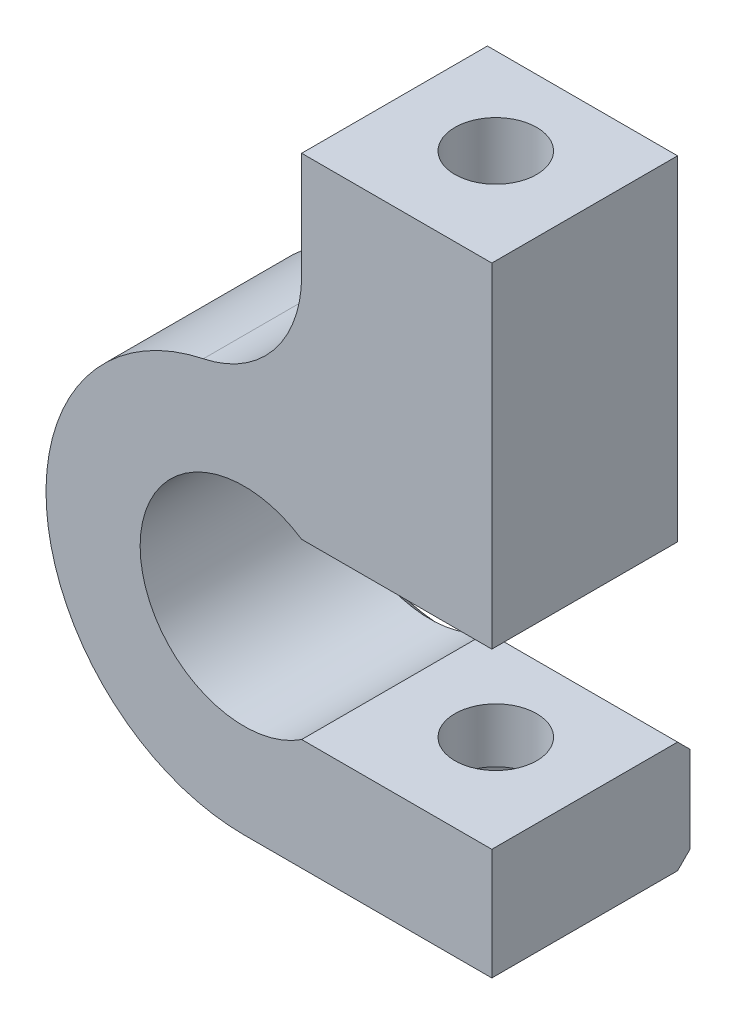
ISO-10303-21;
HEADER;
FILE_DESCRIPTION(('STEP AP214'),'2;1');
FILE_NAME('part.step','',(''),(''),'','','');
FILE_SCHEMA(('AUTOMOTIVE_DESIGN { 1 0 10303 214 1 1 1 1 }'));
ENDSEC;
DATA;
#1=APPLICATION_CONTEXT('core data for automotive mechanical design processes');
#2=APPLICATION_PROTOCOL_DEFINITION('international standard','automotive_design',2000,#1);
#3=PRODUCT_CONTEXT('',#1,'mechanical');
#4=PRODUCT('Part','Part','',(#3));
#5=PRODUCT_RELATED_PRODUCT_CATEGORY('part','',(#4));
#6=PRODUCT_DEFINITION_FORMATION('','',#4);
#7=PRODUCT_DEFINITION_CONTEXT('part definition',#1,'design');
#8=PRODUCT_DEFINITION('design','',#6,#7);
#9=PRODUCT_DEFINITION_SHAPE('','',#8);
#10=(LENGTH_UNIT() NAMED_UNIT(*) SI_UNIT(.MILLI.,.METRE.));
#11=(NAMED_UNIT(*) PLANE_ANGLE_UNIT() SI_UNIT($,.RADIAN.));
#12=(NAMED_UNIT(*) SI_UNIT($,.STERADIAN.) SOLID_ANGLE_UNIT());
#13=UNCERTAINTY_MEASURE_WITH_UNIT(LENGTH_MEASURE(1.E-05),#10,'distance_accuracy_value','');
#14=(GEOMETRIC_REPRESENTATION_CONTEXT(3) GLOBAL_UNCERTAINTY_ASSIGNED_CONTEXT((#13)) GLOBAL_UNIT_ASSIGNED_CONTEXT((#10,
#11,#12)) REPRESENTATION_CONTEXT('',''));
#15=CARTESIAN_POINT('',(0.,0.,0.));
#16=DIRECTION('',(0.,0.,1.));
#17=DIRECTION('',(1.,0.,0.));
#18=AXIS2_PLACEMENT_3D('',#15,#16,#17);
#19=CARTESIAN_POINT('',(6.16,8.,4.));
#20=DIRECTION('',(0.,-1.,0.));
#21=DIRECTION('',(0.,0.,-1.));
#22=AXIS2_PLACEMENT_3D('',#19,#20,#21);
#23=CYLINDRICAL_SURFACE('',#22,1.65);
#24=CARTESIAN_POINT('',(6.16,-3.5,4.));
#25=DIRECTION('',(0.,-1.,0.));
#26=DIRECTION('',(1.,0.,0.));
#27=AXIS2_PLACEMENT_3D('',#24,#25,#26);
#28=CIRCLE('',#27,1.65);
#29=CARTESIAN_POINT('',(7.81,-3.5,4.));
#30=VERTEX_POINT('',#29);
#31=EDGE_CURVE('E276',#30,#30,#28,.T.);
#32=ORIENTED_EDGE('',*,*,#31,.F.);
#33=EDGE_LOOP('',(#32));
#34=FACE_BOUND('',#33,.T.);
#35=CARTESIAN_POINT('',(6.16,-5.7,4.));
#36=DIRECTION('',(0.,-1.,0.));
#37=DIRECTION('',(0.,0.,-1.));
#38=AXIS2_PLACEMENT_3D('',#35,#36,#37);
#39=CIRCLE('',#38,1.65);
#40=CARTESIAN_POINT('',(6.16,-5.7,2.35));
#41=VERTEX_POINT('',#40);
#42=EDGE_CURVE('E261',#41,#41,#39,.F.);
#43=ORIENTED_EDGE('',*,*,#42,.F.);
#44=EDGE_LOOP('',(#43));
#45=FACE_BOUND('',#44,.T.);
#46=ADVANCED_FACE('F40',(#34,#45),#23,.F.);
#47=CARTESIAN_POINT('',(0.,0.,8.));
#48=DIRECTION('',(0.,0.,-1.));
#49=DIRECTION('',(-1.,0.,0.));
#50=AXIS2_PLACEMENT_3D('',#47,#48,#49);
#51=CYLINDRICAL_SURFACE('',#50,4.2);
#52=DIRECTION('',(0.,0.,-1.));
#53=VECTOR('',#52,1.);
#54=CARTESIAN_POINT('',(2.32163735324878,-3.5,8.));
#55=LINE('',#54,#53);
#56=CARTESIAN_POINT('',(2.32163735324878,-3.5,8.));
#57=VERTEX_POINT('',#56);
#58=CARTESIAN_POINT('',(2.32163735324878,-3.5,0.500000000000007));
#59=VERTEX_POINT('',#58);
#60=EDGE_CURVE('E287',#57,#59,#55,.T.);
#61=ORIENTED_EDGE('',*,*,#60,.T.);
#62=CARTESIAN_POINT('',(0.,0.,0.500000000000007));
#63=DIRECTION('',(0.,0.,1.));
#64=DIRECTION('',(1.,0.,0.));
#65=AXIS2_PLACEMENT_3D('',#62,#63,#64);
#66=CIRCLE('',#65,4.2);
#67=CARTESIAN_POINT('',(2.32163735324878,3.5,0.500000000000007));
#68=VERTEX_POINT('',#67);
#69=EDGE_CURVE('E11',#59,#68,#66,.F.);
#70=ORIENTED_EDGE('',*,*,#69,.T.);
#71=DIRECTION('',(0.,0.,-1.));
#72=VECTOR('',#71,1.);
#73=CARTESIAN_POINT('',(2.32163735324878,3.5,8.));
#74=LINE('',#73,#72);
#75=CARTESIAN_POINT('',(2.32163735324878,3.5,8.));
#76=VERTEX_POINT('',#75);
#77=EDGE_CURVE('E301',#76,#68,#74,.T.);
#78=ORIENTED_EDGE('',*,*,#77,.F.);
#79=CARTESIAN_POINT('',(0.,0.,8.));
#80=DIRECTION('',(0.,0.,-1.));
#81=DIRECTION('',(1.,0.,0.));
#82=AXIS2_PLACEMENT_3D('',#79,#80,#81);
#83=CIRCLE('',#82,4.2);
#84=EDGE_CURVE('E277',#57,#76,#83,.T.);
#85=ORIENTED_EDGE('',*,*,#84,.F.);
#86=EDGE_LOOP('',(#61,#70,#78,#85));
#87=FACE_BOUND('',#86,.T.);
#88=ADVANCED_FACE('F396',(#87),#51,.F.);
#89=CARTESIAN_POINT('',(10.,3.5,8.));
#90=DIRECTION('',(0.,1.,0.));
#91=DIRECTION('',(-1.,0.,0.));
#92=AXIS2_PLACEMENT_3D('',#89,#90,#91);
#93=PLANE('',#92);
#94=CARTESIAN_POINT('',(6.16,3.5,4.));
#95=DIRECTION('',(0.,1.,0.));
#96=DIRECTION('',(-1.,0.,0.));
#97=AXIS2_PLACEMENT_3D('',#94,#95,#96);
#98=CIRCLE('',#97,1.65);
#99=CARTESIAN_POINT('',(4.51,3.5,4.));
#100=VERTEX_POINT('',#99);
#101=EDGE_CURVE('E272',#100,#100,#98,.T.);
#102=ORIENTED_EDGE('',*,*,#101,.T.);
#103=EDGE_LOOP('',(#102));
#104=FACE_BOUND('',#103,.T.);
#105=ORIENTED_EDGE('',*,*,#77,.T.);
#106=DIRECTION('',(1.,0.,0.));
#107=VECTOR('',#106,1.);
#108=CARTESIAN_POINT('',(10.,3.5,0.500000000000007));
#109=LINE('',#108,#107);
#110=CARTESIAN_POINT('',(10.,3.5,0.500000000000007));
#111=VERTEX_POINT('',#110);
#112=EDGE_CURVE('E354',#68,#111,#109,.T.);
#113=ORIENTED_EDGE('',*,*,#112,.T.);
#114=DIRECTION('',(0.,0.,-1.));
#115=VECTOR('',#114,1.);
#116=CARTESIAN_POINT('',(10.,3.5,8.));
#117=LINE('',#116,#115);
#118=CARTESIAN_POINT('',(10.,3.5,8.));
#119=VERTEX_POINT('',#118);
#120=EDGE_CURVE('E299',#119,#111,#117,.T.);
#121=ORIENTED_EDGE('',*,*,#120,.F.);
#122=DIRECTION('',(1.,0.,0.));
#123=VECTOR('',#122,1.);
#124=CARTESIAN_POINT('',(10.,3.5,8.));
#125=LINE('',#124,#123);
#126=EDGE_CURVE('E211',#76,#119,#125,.T.);
#127=ORIENTED_EDGE('',*,*,#126,.F.);
#128=EDGE_LOOP('',(#105,#113,#121,#127));
#129=FACE_BOUND('',#128,.T.);
#130=ADVANCED_FACE('F404',(#104,#129),#93,.F.);
#131=CARTESIAN_POINT('',(10.,8.,8.));
#132=DIRECTION('',(-1.,0.,0.));
#133=DIRECTION('',(0.,0.,1.));
#134=AXIS2_PLACEMENT_3D('',#131,#132,#133);
#135=PLANE('',#134);
#136=ORIENTED_EDGE('',*,*,#120,.T.);
#137=DIRECTION('',(0.,1.,0.));
#138=VECTOR('',#137,1.);
#139=CARTESIAN_POINT('',(10.,8.,0.500000000000007));
#140=LINE('',#139,#138);
#141=CARTESIAN_POINT('',(10.,17.,0.500000000000007));
#142=VERTEX_POINT('',#141);
#143=EDGE_CURVE('E199',#111,#142,#140,.T.);
#144=ORIENTED_EDGE('',*,*,#143,.T.);
#145=DIRECTION('',(0.,0.,1.));
#146=VECTOR('',#145,1.);
#147=CARTESIAN_POINT('',(10.,17.,0.));
#148=LINE('',#147,#146);
#149=CARTESIAN_POINT('',(10.,17.,8.));
#150=VERTEX_POINT('',#149);
#151=EDGE_CURVE('E193',#142,#150,#148,.T.);
#152=ORIENTED_EDGE('',*,*,#151,.T.);
#153=DIRECTION('',(0.,1.,0.));
#154=VECTOR('',#153,1.);
#155=CARTESIAN_POINT('',(10.,8.,8.));
#156=LINE('',#155,#154);
#157=EDGE_CURVE('E197',#119,#150,#156,.T.);
#158=ORIENTED_EDGE('',*,*,#157,.F.);
#159=EDGE_LOOP('',(#136,#144,#152,#158));
#160=FACE_BOUND('',#159,.T.);
#161=ADVANCED_FACE('F196',(#160),#135,.F.);
#162=CARTESIAN_POINT('',(0.,0.,8.));
#163=DIRECTION('',(0.,0.,-1.));
#164=DIRECTION('',(-1.,0.,0.));
#165=AXIS2_PLACEMENT_3D('',#162,#163,#164);
#166=CYLINDRICAL_SURFACE('',#165,8.);
#167=DIRECTION('',(0.,0.,-1.));
#168=VECTOR('',#167,1.);
#169=CARTESIAN_POINT('',(-1.64822316723152,7.82836894831876,8.));
#170=LINE('',#169,#168);
#171=CARTESIAN_POINT('',(-1.64822316723152,7.82836894831876,8.));
#172=VERTEX_POINT('',#171);
#173=CARTESIAN_POINT('',(-1.64822316723152,7.82836894831876,0.500000000000007));
#174=VERTEX_POINT('',#173);
#175=EDGE_CURVE('E303',#172,#174,#170,.T.);
#176=ORIENTED_EDGE('',*,*,#175,.T.);
#177=CARTESIAN_POINT('',(0.,0.,0.500000000000007));
#178=DIRECTION('',(0.,0.,1.));
#179=DIRECTION('',(1.,0.,0.));
#180=AXIS2_PLACEMENT_3D('',#177,#178,#179);
#181=CIRCLE('',#180,8.);
#182=CARTESIAN_POINT('',(0.,-8.,0.500000000000007));
#183=VERTEX_POINT('',#182);
#184=EDGE_CURVE('E343',#174,#183,#181,.T.);
#185=ORIENTED_EDGE('',*,*,#184,.T.);
#186=DIRECTION('',(0.,0.,-1.));
#187=VECTOR('',#186,1.);
#188=CARTESIAN_POINT('',(0.,-8.,8.));
#189=LINE('',#188,#187);
#190=CARTESIAN_POINT('',(0.,-8.,8.));
#191=VERTEX_POINT('',#190);
#192=EDGE_CURVE('E296',#191,#183,#189,.T.);
#193=ORIENTED_EDGE('',*,*,#192,.F.);
#194=CARTESIAN_POINT('',(0.,0.,8.));
#195=DIRECTION('',(0.,0.,1.));
#196=DIRECTION('',(1.,0.,0.));
#197=AXIS2_PLACEMENT_3D('',#194,#195,#196);
#198=CIRCLE('',#197,8.);
#199=EDGE_CURVE('E213',#172,#191,#198,.T.);
#200=ORIENTED_EDGE('',*,*,#199,.F.);
#201=EDGE_LOOP('',(#176,#185,#193,#200));
#202=FACE_BOUND('',#201,.T.);
#203=ADVANCED_FACE('F492',(#202),#166,.T.);
#204=CARTESIAN_POINT('',(0.,-8.,8.));
#205=DIRECTION('',(0.,1.,0.));
#206=DIRECTION('',(0.,0.,1.));
#207=AXIS2_PLACEMENT_3D('',#204,#205,#206);
#208=PLANE('',#207);
#209=DIRECTION('',(-1.,0.,0.));
#210=VECTOR('',#209,1.);
#211=CARTESIAN_POINT('',(7.76,-8.,6.7712812921102));
#212=LINE('',#211,#210);
#213=CARTESIAN_POINT('',(7.76,-8.,6.7712812921102));
#214=VERTEX_POINT('',#213);
#215=CARTESIAN_POINT('',(4.56,-8.,6.7712812921102));
#216=VERTEX_POINT('',#215);
#217=EDGE_CURVE('E245',#214,#216,#212,.T.);
#218=ORIENTED_EDGE('',*,*,#217,.F.);
#219=DIRECTION('',(-0.5,0.,0.866025403784438));
#220=VECTOR('',#219,1.);
#221=CARTESIAN_POINT('',(9.36,-8.,4.));
#222=LINE('',#221,#220);
#223=CARTESIAN_POINT('',(9.36,-8.,4.));
#224=VERTEX_POINT('',#223);
#225=EDGE_CURVE('E220',#224,#214,#222,.T.);
#226=ORIENTED_EDGE('',*,*,#225,.F.);
#227=DIRECTION('',(0.5,0.,0.866025403784439));
#228=VECTOR('',#227,1.);
#229=CARTESIAN_POINT('',(7.76,-8.,1.2287187078898));
#230=LINE('',#229,#228);
#231=CARTESIAN_POINT('',(7.76,-8.,1.2287187078898));
#232=VERTEX_POINT('',#231);
#233=EDGE_CURVE('E228',#232,#224,#230,.T.);
#234=ORIENTED_EDGE('',*,*,#233,.F.);
#235=DIRECTION('',(1.,0.,0.));
#236=VECTOR('',#235,1.);
#237=CARTESIAN_POINT('',(4.56,-8.,1.2287187078898));
#238=LINE('',#237,#236);
#239=CARTESIAN_POINT('',(4.56,-8.,1.2287187078898));
#240=VERTEX_POINT('',#239);
#241=EDGE_CURVE('E254',#240,#232,#238,.T.);
#242=ORIENTED_EDGE('',*,*,#241,.F.);
#243=DIRECTION('',(0.5,0.,-0.866025403784439));
#244=VECTOR('',#243,1.);
#245=CARTESIAN_POINT('',(2.96,-8.,4.));
#246=LINE('',#245,#244);
#247=CARTESIAN_POINT('',(2.96,-8.,4.));
#248=VERTEX_POINT('',#247);
#249=EDGE_CURVE('E251',#248,#240,#246,.T.);
#250=ORIENTED_EDGE('',*,*,#249,.F.);
#251=DIRECTION('',(-0.5,0.,-0.866025403784438));
#252=VECTOR('',#251,1.);
#253=CARTESIAN_POINT('',(4.56,-8.,6.7712812921102));
#254=LINE('',#253,#252);
#255=EDGE_CURVE('E248',#216,#248,#254,.T.);
#256=ORIENTED_EDGE('',*,*,#255,.F.);
#257=EDGE_LOOP('',(#218,#226,#234,#242,#250,#256));
#258=FACE_BOUND('',#257,.T.);
#259=ORIENTED_EDGE('',*,*,#192,.T.);
#260=DIRECTION('',(1.,0.,0.));
#261=VECTOR('',#260,1.);
#262=CARTESIAN_POINT('',(0.,-8.,0.5));
#263=LINE('',#262,#261);
#264=CARTESIAN_POINT('',(10.,-8.,0.500000000000002));
#265=VERTEX_POINT('',#264);
#266=EDGE_CURVE('E315',#183,#265,#263,.T.);
#267=ORIENTED_EDGE('',*,*,#266,.T.);
#268=DIRECTION('',(0.,0.,-1.));
#269=VECTOR('',#268,1.);
#270=CARTESIAN_POINT('',(10.,-8.,8.));
#271=LINE('',#270,#269);
#272=CARTESIAN_POINT('',(10.,-8.,8.));
#273=VERTEX_POINT('',#272);
#274=EDGE_CURVE('E293',#273,#265,#271,.T.);
#275=ORIENTED_EDGE('',*,*,#274,.F.);
#276=DIRECTION('',(1.,0.,0.));
#277=VECTOR('',#276,1.);
#278=CARTESIAN_POINT('',(0.,-8.,8.));
#279=LINE('',#278,#277);
#280=EDGE_CURVE('E281',#191,#273,#279,.T.);
#281=ORIENTED_EDGE('',*,*,#280,.F.);
#282=EDGE_LOOP('',(#259,#267,#275,#281));
#283=FACE_BOUND('',#282,.T.);
#284=ADVANCED_FACE('F449',(#258,#283),#208,.F.);
#285=CARTESIAN_POINT('',(10.,-8.,8.));
#286=DIRECTION('',(-1.,0.,0.));
#287=DIRECTION('',(0.,0.,1.));
#288=AXIS2_PLACEMENT_3D('',#285,#286,#287);
#289=PLANE('',#288);
#290=ORIENTED_EDGE('',*,*,#274,.T.);
#291=DIRECTION('',(0.,-0.70710678118655,0.707106781186545));
#292=VECTOR('',#291,1.);
#293=CARTESIAN_POINT('',(10.,-8.,0.5));
#294=LINE('',#293,#292);
#295=CARTESIAN_POINT('',(10.,-7.5,0.));
#296=VERTEX_POINT('',#295);
#297=EDGE_CURVE('E320',#265,#296,#294,.F.);
#298=ORIENTED_EDGE('',*,*,#297,.T.);
#299=DIRECTION('',(0.,1.,0.));
#300=VECTOR('',#299,1.);
#301=CARTESIAN_POINT('',(10.,-8.,0.));
#302=LINE('',#301,#300);
#303=CARTESIAN_POINT('',(10.,-4.00000000000001,0.));
#304=VERTEX_POINT('',#303);
#305=EDGE_CURVE('E275',#296,#304,#302,.T.);
#306=ORIENTED_EDGE('',*,*,#305,.T.);
#307=DIRECTION('',(0.,-0.707106781186549,-0.707106781186546));
#308=VECTOR('',#307,1.);
#309=CARTESIAN_POINT('',(10.,-3.5,0.500000000000007));
#310=LINE('',#309,#308);
#311=CARTESIAN_POINT('',(10.,-3.5,0.500000000000006));
#312=VERTEX_POINT('',#311);
#313=EDGE_CURVE('E318',#304,#312,#310,.F.);
#314=ORIENTED_EDGE('',*,*,#313,.T.);
#315=DIRECTION('',(0.,0.,-1.));
#316=VECTOR('',#315,1.);
#317=CARTESIAN_POINT('',(10.,-3.5,8.));
#318=LINE('',#317,#316);
#319=CARTESIAN_POINT('',(10.,-3.5,8.));
#320=VERTEX_POINT('',#319);
#321=EDGE_CURVE('E291',#320,#312,#318,.T.);
#322=ORIENTED_EDGE('',*,*,#321,.F.);
#323=DIRECTION('',(0.,1.,0.));
#324=VECTOR('',#323,1.);
#325=CARTESIAN_POINT('',(10.,-8.,8.));
#326=LINE('',#325,#324);
#327=EDGE_CURVE('E283',#273,#320,#326,.T.);
#328=ORIENTED_EDGE('',*,*,#327,.F.);
#329=EDGE_LOOP('',(#290,#298,#306,#314,#322,#328));
#330=FACE_BOUND('',#329,.T.);
#331=ADVANCED_FACE('F441',(#330),#289,.F.);
#332=CARTESIAN_POINT('',(10.,-3.5,8.));
#333=DIRECTION('',(0.,-1.,0.));
#334=DIRECTION('',(1.,0.,0.));
#335=AXIS2_PLACEMENT_3D('',#332,#333,#334);
#336=PLANE('',#335);
#337=ORIENTED_EDGE('',*,*,#31,.T.);
#338=EDGE_LOOP('',(#337));
#339=FACE_BOUND('',#338,.T.);
#340=ORIENTED_EDGE('',*,*,#321,.T.);
#341=DIRECTION('',(-1.,0.,0.));
#342=VECTOR('',#341,1.);
#343=CARTESIAN_POINT('',(10.,-3.5,0.500000000000007));
#344=LINE('',#343,#342);
#345=EDGE_CURVE('E55',#312,#59,#344,.T.);
#346=ORIENTED_EDGE('',*,*,#345,.T.);
#347=ORIENTED_EDGE('',*,*,#60,.F.);
#348=DIRECTION('',(-1.,0.,0.));
#349=VECTOR('',#348,1.);
#350=CARTESIAN_POINT('',(10.,-3.5,8.));
#351=LINE('',#350,#349);
#352=EDGE_CURVE('E285',#320,#57,#351,.T.);
#353=ORIENTED_EDGE('',*,*,#352,.F.);
#354=EDGE_LOOP('',(#340,#346,#347,#353));
#355=FACE_BOUND('',#354,.T.);
#356=ADVANCED_FACE('F480',(#339,#355),#336,.F.);
#357=CARTESIAN_POINT('',(0.,0.,8.));
#358=DIRECTION('',(0.,0.,1.));
#359=DIRECTION('',(1.,0.,0.));
#360=AXIS2_PLACEMENT_3D('',#357,#358,#359);
#361=PLANE('',#360);
#362=ORIENTED_EDGE('',*,*,#84,.T.);
#363=ORIENTED_EDGE('',*,*,#126,.T.);
#364=ORIENTED_EDGE('',*,*,#157,.T.);
#365=DIRECTION('',(-1.,0.,0.));
#366=VECTOR('',#365,1.);
#367=CARTESIAN_POINT('',(10.,17.,8.));
#368=LINE('',#367,#366);
#369=CARTESIAN_POINT('',(2.32163735324878,17.,8.));
#370=VERTEX_POINT('',#369);
#371=EDGE_CURVE('E203',#150,#370,#368,.T.);
#372=ORIENTED_EDGE('',*,*,#371,.T.);
#373=DIRECTION('',(0.,-1.,0.));
#374=VECTOR('',#373,1.);
#375=CARTESIAN_POINT('',(2.32163735324878,17.,8.));
#376=LINE('',#375,#374);
#377=CARTESIAN_POINT('',(2.32163735324878,12.721099541018,8.));
#378=VERTEX_POINT('',#377);
#379=EDGE_CURVE('E218',#370,#378,#376,.T.);
#380=ORIENTED_EDGE('',*,*,#379,.T.);
#381=CARTESIAN_POINT('',(-2.67836264675122,12.721099541018,8.));
#382=DIRECTION('',(0.,0.,1.));
#383=DIRECTION('',(1.,0.,0.));
#384=AXIS2_PLACEMENT_3D('',#381,#382,#383);
#385=CIRCLE('',#384,5.);
#386=EDGE_CURVE('E313',#378,#172,#385,.F.);
#387=ORIENTED_EDGE('',*,*,#386,.T.);
#388=ORIENTED_EDGE('',*,*,#199,.T.);
#389=ORIENTED_EDGE('',*,*,#280,.T.);
#390=ORIENTED_EDGE('',*,*,#327,.T.);
#391=ORIENTED_EDGE('',*,*,#352,.T.);
#392=EDGE_LOOP('',(#362,#363,#364,#372,#380,#387,#388,#389,#390,#391));
#393=FACE_BOUND('',#392,.T.);
#394=ADVANCED_FACE('F209',(#393),#361,.T.);
#395=CARTESIAN_POINT('',(0.,0.,0.));
#396=DIRECTION('',(0.,0.,1.));
#397=DIRECTION('',(1.,0.,0.));
#398=AXIS2_PLACEMENT_3D('',#395,#396,#397);
#399=PLANE('',#398);
#400=ORIENTED_EDGE('',*,*,#305,.F.);
#401=DIRECTION('',(-1.,0.,0.));
#402=VECTOR('',#401,1.);
#403=CARTESIAN_POINT('',(0.,-7.5,0.));
#404=LINE('',#403,#402);
#405=CARTESIAN_POINT('',(0.,-7.49999999999999,0.));
#406=VERTEX_POINT('',#405);
#407=EDGE_CURVE('E341',#296,#406,#404,.T.);
#408=ORIENTED_EDGE('',*,*,#407,.T.);
#409=CARTESIAN_POINT('',(0.,0.,0.));
#410=DIRECTION('',(0.,0.,1.));
#411=DIRECTION('',(1.,0.,0.));
#412=AXIS2_PLACEMENT_3D('',#409,#410,#411);
#413=CIRCLE('',#412,7.49999999999999);
#414=CARTESIAN_POINT('',(-1.54520921927955,7.33909588904883,0.));
#415=VERTEX_POINT('',#414);
#416=EDGE_CURVE('E338',#406,#415,#413,.F.);
#417=ORIENTED_EDGE('',*,*,#416,.T.);
#418=CARTESIAN_POINT('',(-2.67836264675122,12.721099541018,0.));
#419=DIRECTION('',(0.,0.,1.));
#420=DIRECTION('',(1.,0.,0.));
#421=AXIS2_PLACEMENT_3D('',#418,#419,#420);
#422=CIRCLE('',#421,5.50000000000001);
#423=CARTESIAN_POINT('',(2.82163735324879,12.721099541018,0.));
#424=VERTEX_POINT('',#423);
#425=EDGE_CURVE('E335',#415,#424,#422,.T.);
#426=ORIENTED_EDGE('',*,*,#425,.T.);
#427=DIRECTION('',(0.,1.,0.));
#428=VECTOR('',#427,1.);
#429=CARTESIAN_POINT('',(2.82163735324879,17.,0.));
#430=LINE('',#429,#428);
#431=CARTESIAN_POINT('',(2.82163735324879,16.5,0.));
#432=VERTEX_POINT('',#431);
#433=EDGE_CURVE('E333',#424,#432,#430,.T.);
#434=ORIENTED_EDGE('',*,*,#433,.T.);
#435=DIRECTION('',(1.,0.,0.));
#436=VECTOR('',#435,1.);
#437=CARTESIAN_POINT('',(0.,16.5,0.));
#438=LINE('',#437,#436);
#439=CARTESIAN_POINT('',(9.49999999999999,16.5,0.));
#440=VERTEX_POINT('',#439);
#441=EDGE_CURVE('E331',#432,#440,#438,.T.);
#442=ORIENTED_EDGE('',*,*,#441,.T.);
#443=DIRECTION('',(0.,-1.,0.));
#444=VECTOR('',#443,1.);
#445=CARTESIAN_POINT('',(9.49999999999999,0.,0.));
#446=LINE('',#445,#444);
#447=CARTESIAN_POINT('',(9.49999999999999,4.00000000000001,0.));
#448=VERTEX_POINT('',#447);
#449=EDGE_CURVE('E329',#440,#448,#446,.T.);
#450=ORIENTED_EDGE('',*,*,#449,.T.);
#451=DIRECTION('',(-1.,0.,0.));
#452=VECTOR('',#451,1.);
#453=CARTESIAN_POINT('',(0.,4.00000000000001,0.));
#454=LINE('',#453,#452);
#455=CARTESIAN_POINT('',(2.46779253585164,3.99999999999938,0.));
#456=VERTEX_POINT('',#455);
#457=EDGE_CURVE('E327',#448,#456,#454,.T.);
#458=ORIENTED_EDGE('',*,*,#457,.T.);
#459=CARTESIAN_POINT('',(0.,0.,0.));
#460=DIRECTION('',(0.,0.,1.));
#461=DIRECTION('',(1.,0.,0.));
#462=AXIS2_PLACEMENT_3D('',#459,#460,#461);
#463=CIRCLE('',#462,4.70000000000001);
#464=CARTESIAN_POINT('',(2.46779253585164,-3.99999999999938,0.));
#465=VERTEX_POINT('',#464);
#466=EDGE_CURVE('E322',#456,#465,#463,.T.);
#467=ORIENTED_EDGE('',*,*,#466,.T.);
#468=DIRECTION('',(1.,0.,0.));
#469=VECTOR('',#468,1.);
#470=CARTESIAN_POINT('',(0.,-4.00000000000001,0.));
#471=LINE('',#470,#469);
#472=EDGE_CURVE('E325',#465,#304,#471,.T.);
#473=ORIENTED_EDGE('',*,*,#472,.T.);
#474=EDGE_LOOP('',(#400,#408,#417,#426,#434,#442,#450,#458,#467,#473));
#475=FACE_BOUND('',#474,.T.);
#476=ADVANCED_FACE('F412',(#475),#399,.F.);
#477=ORIENTED_EDGE('',*,*,#101,.F.);
#478=EDGE_LOOP('',(#477));
#479=FACE_BOUND('',#478,.T.);
#480=CARTESIAN_POINT('',(6.16,17.,4.));
#481=DIRECTION('',(0.,-1.,0.));
#482=DIRECTION('',(1.,0.,0.));
#483=AXIS2_PLACEMENT_3D('',#480,#481,#482);
#484=CIRCLE('',#483,1.65);
#485=CARTESIAN_POINT('',(7.81,17.,4.));
#486=VERTEX_POINT('',#485);
#487=EDGE_CURVE('E428',#486,#486,#484,.T.);
#488=ORIENTED_EDGE('',*,*,#487,.F.);
#489=EDGE_LOOP('',(#488));
#490=FACE_BOUND('',#489,.T.);
#491=ADVANCED_FACE('F399',(#479,#490),#23,.F.);
#492=CARTESIAN_POINT('',(0.,-5.7,0.));
#493=DIRECTION('',(0.,-1.,0.));
#494=DIRECTION('',(0.,0.,-1.));
#495=AXIS2_PLACEMENT_3D('',#492,#493,#494);
#496=PLANE('',#495);
#497=DIRECTION('',(-0.5,0.,0.866025403784438));
#498=VECTOR('',#497,1.);
#499=CARTESIAN_POINT('',(9.36,-5.7,4.));
#500=LINE('',#499,#498);
#501=CARTESIAN_POINT('',(9.36,-5.7,4.));
#502=VERTEX_POINT('',#501);
#503=CARTESIAN_POINT('',(7.76,-5.7,6.7712812921102));
#504=VERTEX_POINT('',#503);
#505=EDGE_CURVE('E224',#502,#504,#500,.T.);
#506=ORIENTED_EDGE('',*,*,#505,.T.);
#507=DIRECTION('',(-1.,0.,0.));
#508=VECTOR('',#507,1.);
#509=CARTESIAN_POINT('',(7.76,-5.7,6.7712812921102));
#510=LINE('',#509,#508);
#511=CARTESIAN_POINT('',(4.56,-5.7,6.7712812921102));
#512=VERTEX_POINT('',#511);
#513=EDGE_CURVE('E227',#504,#512,#510,.T.);
#514=ORIENTED_EDGE('',*,*,#513,.T.);
#515=DIRECTION('',(-0.5,0.,-0.866025403784438));
#516=VECTOR('',#515,1.);
#517=CARTESIAN_POINT('',(4.56,-5.7,6.7712812921102));
#518=LINE('',#517,#516);
#519=CARTESIAN_POINT('',(2.96,-5.7,4.));
#520=VERTEX_POINT('',#519);
#521=EDGE_CURVE('E231',#512,#520,#518,.T.);
#522=ORIENTED_EDGE('',*,*,#521,.T.);
#523=DIRECTION('',(0.5,0.,-0.866025403784439));
#524=VECTOR('',#523,1.);
#525=CARTESIAN_POINT('',(2.96,-5.7,4.));
#526=LINE('',#525,#524);
#527=CARTESIAN_POINT('',(4.56,-5.7,1.2287187078898));
#528=VERTEX_POINT('',#527);
#529=EDGE_CURVE('E234',#520,#528,#526,.T.);
#530=ORIENTED_EDGE('',*,*,#529,.T.);
#531=DIRECTION('',(1.,0.,0.));
#532=VECTOR('',#531,1.);
#533=CARTESIAN_POINT('',(4.56,-5.7,1.2287187078898));
#534=LINE('',#533,#532);
#535=CARTESIAN_POINT('',(7.76,-5.7,1.2287187078898));
#536=VERTEX_POINT('',#535);
#537=EDGE_CURVE('E237',#528,#536,#534,.T.);
#538=ORIENTED_EDGE('',*,*,#537,.T.);
#539=DIRECTION('',(0.5,0.,0.866025403784439));
#540=VECTOR('',#539,1.);
#541=CARTESIAN_POINT('',(7.76,-5.7,1.2287187078898));
#542=LINE('',#541,#540);
#543=EDGE_CURVE('E240',#536,#502,#542,.T.);
#544=ORIENTED_EDGE('',*,*,#543,.T.);
#545=EDGE_LOOP('',(#506,#514,#522,#530,#538,#544));
#546=FACE_BOUND('',#545,.T.);
#547=ORIENTED_EDGE('',*,*,#42,.T.);
#548=EDGE_LOOP('',(#547));
#549=FACE_BOUND('',#548,.T.);
#550=ADVANCED_FACE('F411',(#546,#549),#496,.T.);
#551=CARTESIAN_POINT('',(9.36,-5.7,4.));
#552=DIRECTION('',(0.866025403784439,0.,0.5));
#553=DIRECTION('',(0.5,0.,-0.866025403784439));
#554=AXIS2_PLACEMENT_3D('',#551,#552,#553);
#555=PLANE('',#554);
#556=ORIENTED_EDGE('',*,*,#225,.T.);
#557=DIRECTION('',(0.,-1.,0.));
#558=VECTOR('',#557,1.);
#559=CARTESIAN_POINT('',(7.76,-5.7,6.7712812921102));
#560=LINE('',#559,#558);
#561=EDGE_CURVE('E243',#504,#214,#560,.T.);
#562=ORIENTED_EDGE('',*,*,#561,.F.);
#563=ORIENTED_EDGE('',*,*,#505,.F.);
#564=DIRECTION('',(0.,-1.,0.));
#565=VECTOR('',#564,1.);
#566=CARTESIAN_POINT('',(9.36,-5.7,4.));
#567=LINE('',#566,#565);
#568=EDGE_CURVE('E259',#502,#224,#567,.T.);
#569=ORIENTED_EDGE('',*,*,#568,.T.);
#570=EDGE_LOOP('',(#556,#562,#563,#569));
#571=FACE_BOUND('',#570,.T.);
#572=ADVANCED_FACE('F418',(#571),#555,.F.);
#573=CARTESIAN_POINT('',(7.76,-5.7,1.2287187078898));
#574=DIRECTION('',(0.866025403784439,0.,-0.5));
#575=DIRECTION('',(-0.5,0.,-0.866025403784438));
#576=AXIS2_PLACEMENT_3D('',#573,#574,#575);
#577=PLANE('',#576);
#578=ORIENTED_EDGE('',*,*,#233,.T.);
#579=ORIENTED_EDGE('',*,*,#568,.F.);
#580=ORIENTED_EDGE('',*,*,#543,.F.);
#581=DIRECTION('',(0.,-1.,0.));
#582=VECTOR('',#581,1.);
#583=CARTESIAN_POINT('',(7.76,-5.7,1.2287187078898));
#584=LINE('',#583,#582);
#585=EDGE_CURVE('E262',#536,#232,#584,.T.);
#586=ORIENTED_EDGE('',*,*,#585,.T.);
#587=EDGE_LOOP('',(#578,#579,#580,#586));
#588=FACE_BOUND('',#587,.T.);
#589=ADVANCED_FACE('F656',(#588),#577,.F.);
#590=CARTESIAN_POINT('',(4.56,-5.7,1.2287187078898));
#591=DIRECTION('',(0.,0.,-1.));
#592=DIRECTION('',(-1.,0.,0.));
#593=AXIS2_PLACEMENT_3D('',#590,#591,#592);
#594=PLANE('',#593);
#595=ORIENTED_EDGE('',*,*,#241,.T.);
#596=ORIENTED_EDGE('',*,*,#585,.F.);
#597=ORIENTED_EDGE('',*,*,#537,.F.);
#598=DIRECTION('',(0.,-1.,0.));
#599=VECTOR('',#598,1.);
#600=CARTESIAN_POINT('',(4.56,-5.7,1.2287187078898));
#601=LINE('',#600,#599);
#602=EDGE_CURVE('E264',#528,#240,#601,.T.);
#603=ORIENTED_EDGE('',*,*,#602,.T.);
#604=EDGE_LOOP('',(#595,#596,#597,#603));
#605=FACE_BOUND('',#604,.T.);
#606=ADVANCED_FACE('F647',(#605),#594,.F.);
#607=CARTESIAN_POINT('',(2.96,-5.7,4.));
#608=DIRECTION('',(-0.866025403784439,0.,-0.5));
#609=DIRECTION('',(-0.5,0.,0.866025403784439));
#610=AXIS2_PLACEMENT_3D('',#607,#608,#609);
#611=PLANE('',#610);
#612=ORIENTED_EDGE('',*,*,#249,.T.);
#613=ORIENTED_EDGE('',*,*,#602,.F.);
#614=ORIENTED_EDGE('',*,*,#529,.F.);
#615=DIRECTION('',(0.,-1.,0.));
#616=VECTOR('',#615,1.);
#617=CARTESIAN_POINT('',(2.96,-5.7,4.));
#618=LINE('',#617,#616);
#619=EDGE_CURVE('E266',#520,#248,#618,.T.);
#620=ORIENTED_EDGE('',*,*,#619,.T.);
#621=EDGE_LOOP('',(#612,#613,#614,#620));
#622=FACE_BOUND('',#621,.T.);
#623=ADVANCED_FACE('F638',(#622),#611,.F.);
#624=CARTESIAN_POINT('',(4.56,-5.7,6.7712812921102));
#625=DIRECTION('',(-0.866025403784439,0.,0.5));
#626=DIRECTION('',(0.5,0.,0.866025403784439));
#627=AXIS2_PLACEMENT_3D('',#624,#625,#626);
#628=PLANE('',#627);
#629=ORIENTED_EDGE('',*,*,#255,.T.);
#630=ORIENTED_EDGE('',*,*,#619,.F.);
#631=ORIENTED_EDGE('',*,*,#521,.F.);
#632=DIRECTION('',(0.,-1.,0.));
#633=VECTOR('',#632,1.);
#634=CARTESIAN_POINT('',(4.56,-5.7,6.7712812921102));
#635=LINE('',#634,#633);
#636=EDGE_CURVE('E268',#512,#216,#635,.T.);
#637=ORIENTED_EDGE('',*,*,#636,.T.);
#638=EDGE_LOOP('',(#629,#630,#631,#637));
#639=FACE_BOUND('',#638,.T.);
#640=ADVANCED_FACE('F629',(#639),#628,.F.);
#641=CARTESIAN_POINT('',(7.76,-5.7,6.7712812921102));
#642=DIRECTION('',(0.,0.,1.));
#643=DIRECTION('',(1.,0.,0.));
#644=AXIS2_PLACEMENT_3D('',#641,#642,#643);
#645=PLANE('',#644);
#646=ORIENTED_EDGE('',*,*,#217,.T.);
#647=ORIENTED_EDGE('',*,*,#636,.F.);
#648=ORIENTED_EDGE('',*,*,#513,.F.);
#649=ORIENTED_EDGE('',*,*,#561,.T.);
#650=EDGE_LOOP('',(#646,#647,#648,#649));
#651=FACE_BOUND('',#650,.T.);
#652=ADVANCED_FACE('F584',(#651),#645,.F.);
#653=CARTESIAN_POINT('',(2.32163735324878,17.,8.));
#654=DIRECTION('',(-1.,0.,0.));
#655=DIRECTION('',(0.,-1.,0.));
#656=AXIS2_PLACEMENT_3D('',#653,#654,#655);
#657=PLANE('',#656);
#658=DIRECTION('',(0.,0.,-1.));
#659=VECTOR('',#658,1.);
#660=CARTESIAN_POINT('',(2.32163735324878,17.,8.));
#661=LINE('',#660,#659);
#662=CARTESIAN_POINT('',(2.32163735324878,17.,0.500000000000007));
#663=VERTEX_POINT('',#662);
#664=EDGE_CURVE('E204',#370,#663,#661,.T.);
#665=ORIENTED_EDGE('',*,*,#664,.T.);
#666=DIRECTION('',(0.,-1.,0.));
#667=VECTOR('',#666,1.);
#668=CARTESIAN_POINT('',(2.32163735324878,12.721099541018,0.500000000000007));
#669=LINE('',#668,#667);
#670=CARTESIAN_POINT('',(2.32163735324878,12.721099541018,0.500000000000007));
#671=VERTEX_POINT('',#670);
#672=EDGE_CURVE('E349',#663,#671,#669,.T.);
#673=ORIENTED_EDGE('',*,*,#672,.T.);
#674=DIRECTION('',(0.,0.,-1.));
#675=VECTOR('',#674,1.);
#676=CARTESIAN_POINT('',(2.32163735324878,12.721099541018,8.));
#677=LINE('',#676,#675);
#678=EDGE_CURVE('E311',#671,#378,#677,.F.);
#679=ORIENTED_EDGE('',*,*,#678,.T.);
#680=ORIENTED_EDGE('',*,*,#379,.F.);
#681=EDGE_LOOP('',(#665,#673,#679,#680));
#682=FACE_BOUND('',#681,.T.);
#683=ADVANCED_FACE('F576',(#682),#657,.T.);
#684=CARTESIAN_POINT('',(0.,17.,0.));
#685=DIRECTION('',(0.,-1.,0.));
#686=DIRECTION('',(1.,0.,0.));
#687=AXIS2_PLACEMENT_3D('',#684,#685,#686);
#688=PLANE('',#687);
#689=ORIENTED_EDGE('',*,*,#487,.T.);
#690=EDGE_LOOP('',(#689));
#691=FACE_BOUND('',#690,.T.);
#692=ORIENTED_EDGE('',*,*,#151,.F.);
#693=DIRECTION('',(-1.,0.,0.));
#694=VECTOR('',#693,1.);
#695=CARTESIAN_POINT('',(0.,17.,0.500000000000007));
#696=LINE('',#695,#694);
#697=EDGE_CURVE('E351',#142,#663,#696,.T.);
#698=ORIENTED_EDGE('',*,*,#697,.T.);
#699=ORIENTED_EDGE('',*,*,#664,.F.);
#700=ORIENTED_EDGE('',*,*,#371,.F.);
#701=EDGE_LOOP('',(#692,#698,#699,#700));
#702=FACE_BOUND('',#701,.T.);
#703=ADVANCED_FACE('F216',(#691,#702),#688,.F.);
#704=CARTESIAN_POINT('',(-2.67836264675122,12.721099541018,8.));
#705=DIRECTION('',(0.,0.,-1.));
#706=DIRECTION('',(-1.,0.,0.));
#707=AXIS2_PLACEMENT_3D('',#704,#705,#706);
#708=CYLINDRICAL_SURFACE('',#707,5.);
#709=ORIENTED_EDGE('',*,*,#678,.F.);
#710=CARTESIAN_POINT('',(-2.67836264675122,12.721099541018,0.500000000000007));
#711=DIRECTION('',(0.,0.,1.));
#712=DIRECTION('',(1.,0.,0.));
#713=AXIS2_PLACEMENT_3D('',#710,#711,#712);
#714=CIRCLE('',#713,5.);
#715=EDGE_CURVE('E346',#671,#174,#714,.F.);
#716=ORIENTED_EDGE('',*,*,#715,.T.);
#717=ORIENTED_EDGE('',*,*,#175,.F.);
#718=ORIENTED_EDGE('',*,*,#386,.F.);
#719=EDGE_LOOP('',(#709,#716,#717,#718));
#720=FACE_BOUND('',#719,.T.);
#721=ADVANCED_FACE('F501',(#720),#708,.F.);
#722=CARTESIAN_POINT('',(10.,-3.5,0.500000000000007));
#723=DIRECTION('',(0.,-0.707106781186546,0.707106781186549));
#724=DIRECTION('',(-1.,0.,0.));
#725=AXIS2_PLACEMENT_3D('',#722,#723,#724);
#726=PLANE('',#725);
#727=ORIENTED_EDGE('',*,*,#313,.F.);
#728=ORIENTED_EDGE('',*,*,#472,.F.);
#729=CARTESIAN_POINT('',(2.32163735324878,-3.5,0.500000000000007));
#730=CARTESIAN_POINT('',(2.34670930397178,-3.58322920535378,0.416770794646231));
#731=CARTESIAN_POINT('',(2.37142488395965,-3.66651049613701,0.333489503862997));
#732=CARTESIAN_POINT('',(2.42014327742831,-3.83317716291073,0.166822837089281));
#733=CARTESIAN_POINT('',(2.44414609164165,-3.91656253879414,0.0834374612058666));
#734=CARTESIAN_POINT('',(2.46779253585245,-3.99999999999994,0.));
#735=B_SPLINE_CURVE_WITH_KNOTS('',3,(#729,#730,#731,#732,#733,#734),.UNSPECIFIED.,.F.,.F.,(4,2,
4),(0.,0.361028614030275,0.722056856988319),.UNSPECIFIED.);
#736=EDGE_CURVE('E45',#59,#465,#735,.T.);
#737=ORIENTED_EDGE('',*,*,#736,.F.);
#738=ORIENTED_EDGE('',*,*,#345,.F.);
#739=EDGE_LOOP('',(#727,#728,#737,#738));
#740=FACE_BOUND('',#739,.T.);
#741=ADVANCED_FACE('F42',(#740),#726,.F.);
#742=CARTESIAN_POINT('',(0.,0.,0.500000000000007));
#743=DIRECTION('',(0.,0.,-1.));
#744=DIRECTION('',(-1.,0.,0.));
#745=AXIS2_PLACEMENT_3D('',#742,#743,#744);
#746=CONICAL_SURFACE('',#745,4.2,0.785398163397451);
#747=ORIENTED_EDGE('',*,*,#736,.T.);
#748=ORIENTED_EDGE('',*,*,#466,.F.);
#749=CARTESIAN_POINT('',(2.46779253585203,4.00000000000001,0.));
#750=CARTESIAN_POINT('',(2.44414609164119,3.91656253879421,0.0834374612057954));
#751=CARTESIAN_POINT('',(2.42014327742799,3.83317716291078,0.16682283708923));
#752=CARTESIAN_POINT('',(2.37142488395998,3.66651049613697,0.333489503863039));
#753=CARTESIAN_POINT('',(2.3467093039726,3.58322920535366,0.416770794646345));
#754=CARTESIAN_POINT('',(2.32163735325029,3.49999999999979,0.500000000000221));
#755=B_SPLINE_CURVE_WITH_KNOTS('',3,(#749,#750,#751,#752,#753,#754),.UNSPECIFIED.,.F.,.F.,(4,2,
4),(0.,0.361028242958043,0.72205685698831),.UNSPECIFIED.);
#756=EDGE_CURVE('E375',#68,#456,#755,.F.);
#757=ORIENTED_EDGE('',*,*,#756,.F.);
#758=ORIENTED_EDGE('',*,*,#69,.F.);
#759=EDGE_LOOP('',(#747,#748,#757,#758));
#760=FACE_BOUND('',#759,.T.);
#761=ADVANCED_FACE('F380',(#760),#746,.F.);
#762=CARTESIAN_POINT('',(10.,3.5,0.500000000000007));
#763=DIRECTION('',(0.,0.707106781186546,0.707106781186549));
#764=DIRECTION('',(1.,0.,0.));
#765=AXIS2_PLACEMENT_3D('',#762,#763,#764);
#766=PLANE('',#765);
#767=ORIENTED_EDGE('',*,*,#756,.T.);
#768=ORIENTED_EDGE('',*,*,#457,.F.);
#769=DIRECTION('',(0.577350269189627,-0.577350269189627,0.577350269189624));
#770=VECTOR('',#769,1.);
#771=CARTESIAN_POINT('',(10.,3.5,0.500000000000007));
#772=LINE('',#771,#770);
#773=EDGE_CURVE('E373',#111,#448,#772,.F.);
#774=ORIENTED_EDGE('',*,*,#773,.F.);
#775=ORIENTED_EDGE('',*,*,#112,.F.);
#776=EDGE_LOOP('',(#767,#768,#774,#775));
#777=FACE_BOUND('',#776,.T.);
#778=ADVANCED_FACE('F383',(#777),#766,.F.);
#779=CARTESIAN_POINT('',(10.,8.,0.500000000000007));
#780=DIRECTION('',(-0.707106781186546,0.,0.70710678118655));
#781=DIRECTION('',(0.,1.,0.));
#782=AXIS2_PLACEMENT_3D('',#779,#780,#781);
#783=PLANE('',#782);
#784=ORIENTED_EDGE('',*,*,#773,.T.);
#785=ORIENTED_EDGE('',*,*,#449,.F.);
#786=DIRECTION('',(0.577350269189626,0.577350269189628,0.577350269189623));
#787=VECTOR('',#786,1.);
#788=CARTESIAN_POINT('',(6.99999999999999,14.,-2.49999999999999));
#789=LINE('',#788,#787);
#790=EDGE_CURVE('E370',#142,#440,#789,.F.);
#791=ORIENTED_EDGE('',*,*,#790,.F.);
#792=ORIENTED_EDGE('',*,*,#143,.F.);
#793=EDGE_LOOP('',(#784,#785,#791,#792));
#794=FACE_BOUND('',#793,.T.);
#795=ADVANCED_FACE('F386',(#794),#783,.F.);
#796=CARTESIAN_POINT('',(0.,16.5,0.));
#797=DIRECTION('',(0.,-0.707106781186544,0.707106781186551));
#798=DIRECTION('',(1.,0.,0.));
#799=AXIS2_PLACEMENT_3D('',#796,#797,#798);
#800=PLANE('',#799);
#801=ORIENTED_EDGE('',*,*,#790,.T.);
#802=ORIENTED_EDGE('',*,*,#441,.F.);
#803=DIRECTION('',(0.577350269189626,-0.577350269189628,-0.577350269189623));
#804=VECTOR('',#803,1.);
#805=CARTESIAN_POINT('',(1.88109156883253,17.4405457844163,0.94054578441626));
#806=LINE('',#805,#804);
#807=EDGE_CURVE('E367',#663,#432,#806,.T.);
#808=ORIENTED_EDGE('',*,*,#807,.F.);
#809=ORIENTED_EDGE('',*,*,#697,.F.);
#810=EDGE_LOOP('',(#801,#802,#808,#809));
#811=FACE_BOUND('',#810,.T.);
#812=ADVANCED_FACE('F392',(#811),#800,.F.);
#813=CARTESIAN_POINT('',(2.32163735324878,17.,0.500000000000007));
#814=DIRECTION('',(-0.707106781186546,0.,-0.707106781186549));
#815=DIRECTION('',(0.,1.,0.));
#816=AXIS2_PLACEMENT_3D('',#813,#814,#815);
#817=PLANE('',#816);
#818=ORIENTED_EDGE('',*,*,#807,.T.);
#819=ORIENTED_EDGE('',*,*,#433,.F.);
#820=DIRECTION('',(0.70710678118655,0.,-0.707106781186546));
#821=VECTOR('',#820,1.);
#822=CARTESIAN_POINT('',(2.32163735324878,12.721099541018,0.500000000000007));
#823=LINE('',#822,#821);
#824=EDGE_CURVE('E364',#671,#424,#823,.T.);
#825=ORIENTED_EDGE('',*,*,#824,.F.);
#826=ORIENTED_EDGE('',*,*,#672,.F.);
#827=EDGE_LOOP('',(#818,#819,#825,#826));
#828=FACE_BOUND('',#827,.T.);
#829=ADVANCED_FACE('F468',(#828),#817,.T.);
#830=CARTESIAN_POINT('',(-2.67836264675122,12.721099541018,0.));
#831=DIRECTION('',(0.,0.,-1.));
#832=DIRECTION('',(-1.,0.,0.));
#833=AXIS2_PLACEMENT_3D('',#830,#831,#832);
#834=CONICAL_SURFACE('',#833,5.50000000000001,0.785398163397451);
#835=ORIENTED_EDGE('',*,*,#824,.T.);
#836=ORIENTED_EDGE('',*,*,#425,.F.);
#837=DIRECTION('',(0.145683722307273,-0.691936596123302,-0.707106781186545));
#838=VECTOR('',#837,1.);
#839=CARTESIAN_POINT('',(-1.64822316723152,7.82836894831876,0.500000000000007));
#840=LINE('',#839,#838);
#841=EDGE_CURVE('E360',#174,#415,#840,.T.);
#842=ORIENTED_EDGE('',*,*,#841,.F.);
#843=ORIENTED_EDGE('',*,*,#715,.F.);
#844=EDGE_LOOP('',(#835,#836,#842,#843));
#845=FACE_BOUND('',#844,.T.);
#846=ADVANCED_FACE('F463',(#845),#834,.F.);
#847=CARTESIAN_POINT('',(0.,0.,0.500000000000007));
#848=DIRECTION('',(0.,0.,1.));
#849=DIRECTION('',(1.,0.,0.));
#850=AXIS2_PLACEMENT_3D('',#847,#848,#849);
#851=CONICAL_SURFACE('',#850,8.,0.785398163397451);
#852=ORIENTED_EDGE('',*,*,#841,.T.);
#853=ORIENTED_EDGE('',*,*,#416,.F.);
#854=DIRECTION('',(0.,0.70710678118655,-0.707106781186546));
#855=VECTOR('',#854,1.);
#856=CARTESIAN_POINT('',(0.,-8.,0.500000000000007));
#857=LINE('',#856,#855);
#858=EDGE_CURVE('E357',#183,#406,#857,.T.);
#859=ORIENTED_EDGE('',*,*,#858,.F.);
#860=ORIENTED_EDGE('',*,*,#184,.F.);
#861=EDGE_LOOP('',(#852,#853,#859,#860));
#862=FACE_BOUND('',#861,.T.);
#863=ADVANCED_FACE('F458',(#862),#851,.T.);
#864=CARTESIAN_POINT('',(0.,-8.,0.5));
#865=DIRECTION('',(0.,0.707106781186545,0.70710678118655));
#866=DIRECTION('',(1.,0.,0.));
#867=AXIS2_PLACEMENT_3D('',#864,#865,#866);
#868=PLANE('',#867);
#869=ORIENTED_EDGE('',*,*,#858,.T.);
#870=ORIENTED_EDGE('',*,*,#407,.F.);
#871=ORIENTED_EDGE('',*,*,#297,.F.);
#872=ORIENTED_EDGE('',*,*,#266,.F.);
#873=EDGE_LOOP('',(#869,#870,#871,#872));
#874=FACE_BOUND('',#873,.T.);
#875=ADVANCED_FACE('F447',(#874),#868,.F.);
#876=CLOSED_SHELL('',(#46,#88,#130,#161,#203,#284,#331,#356,#394,#476,#491,#550,#572,#589,#606,
#623,#640,#652,#683,#703,#721,#741,#761,#778,#795,#812,#829,#846,#863,#875));
#877=MANIFOLD_SOLID_BREP('B2',#876);
#878=ADVANCED_BREP_SHAPE_REPRESENTATION('',(#18,#877),#14);
#879=SHAPE_DEFINITION_REPRESENTATION(#9,#878);
ENDSEC;
END-ISO-10303-21;
